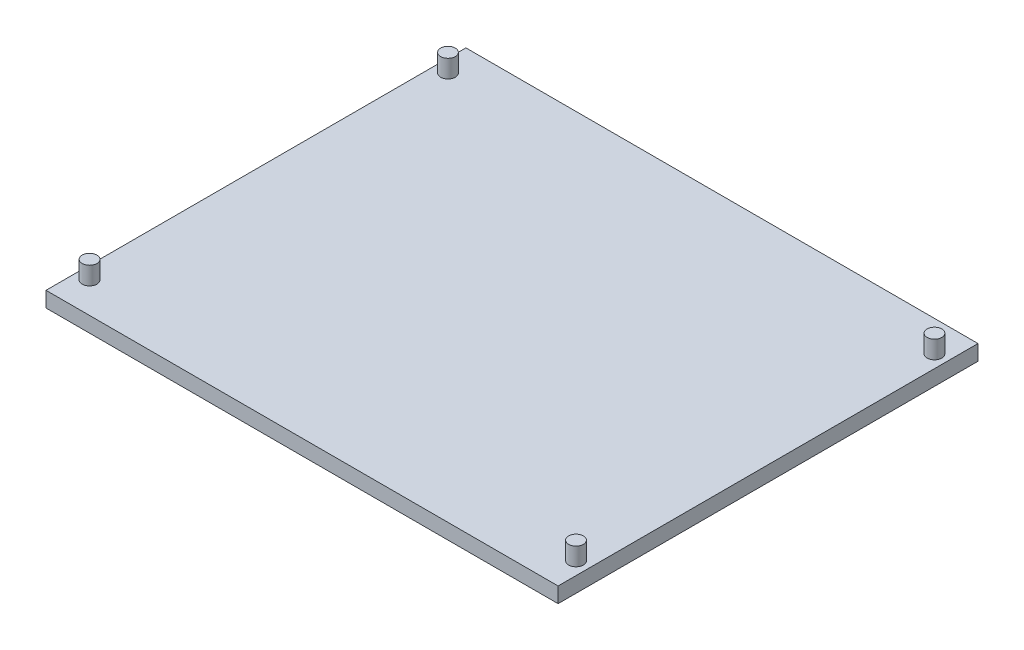
ISO-10303-21;
HEADER;
FILE_DESCRIPTION(('STEP AP214'),'2;1');
FILE_NAME('part.step','',(''),(''),'','','');
FILE_SCHEMA(('AUTOMOTIVE_DESIGN { 1 0 10303 214 1 1 1 1 }'));
ENDSEC;
DATA;
#1=APPLICATION_CONTEXT('core data for automotive mechanical design processes');
#2=APPLICATION_PROTOCOL_DEFINITION('international standard','automotive_design',2000,#1);
#3=PRODUCT_CONTEXT('',#1,'mechanical');
#4=PRODUCT('Part','Part','',(#3));
#5=PRODUCT_RELATED_PRODUCT_CATEGORY('part','',(#4));
#6=PRODUCT_DEFINITION_FORMATION('','',#4);
#7=PRODUCT_DEFINITION_CONTEXT('part definition',#1,'design');
#8=PRODUCT_DEFINITION('design','',#6,#7);
#9=PRODUCT_DEFINITION_SHAPE('','',#8);
#10=(LENGTH_UNIT() NAMED_UNIT(*) SI_UNIT(.MILLI.,.METRE.));
#11=(NAMED_UNIT(*) PLANE_ANGLE_UNIT() SI_UNIT($,.RADIAN.));
#12=(NAMED_UNIT(*) SI_UNIT($,.STERADIAN.) SOLID_ANGLE_UNIT());
#13=UNCERTAINTY_MEASURE_WITH_UNIT(LENGTH_MEASURE(1.E-05),#10,'distance_accuracy_value','');
#14=(GEOMETRIC_REPRESENTATION_CONTEXT(3) GLOBAL_UNCERTAINTY_ASSIGNED_CONTEXT((#13)) GLOBAL_UNIT_ASSIGNED_CONTEXT((#10,
#11,#12)) REPRESENTATION_CONTEXT('',''));
#15=CARTESIAN_POINT('',(0.,0.,0.));
#16=DIRECTION('',(0.,0.,1.));
#17=DIRECTION('',(1.,0.,0.));
#18=AXIS2_PLACEMENT_3D('',#15,#16,#17);
#19=CARTESIAN_POINT('',(50.,3.,41.));
#20=DIRECTION('',(-1.,0.,0.));
#21=DIRECTION('',(0.,0.,1.));
#22=AXIS2_PLACEMENT_3D('',#19,#20,#21);
#23=PLANE('',#22);
#24=DIRECTION('',(0.,0.,-1.));
#25=VECTOR('',#24,1.);
#26=CARTESIAN_POINT('',(50.,0.,41.));
#27=LINE('',#26,#25);
#28=CARTESIAN_POINT('',(50.,0.,41.));
#29=VERTEX_POINT('',#28);
#30=CARTESIAN_POINT('',(50.,0.,-41.));
#31=VERTEX_POINT('',#30);
#32=EDGE_CURVE('E108',#29,#31,#27,.T.);
#33=ORIENTED_EDGE('',*,*,#32,.T.);
#34=DIRECTION('',(0.,-1.,0.));
#35=VECTOR('',#34,1.);
#36=CARTESIAN_POINT('',(50.,3.,-41.));
#37=LINE('',#36,#35);
#38=CARTESIAN_POINT('',(50.,3.,-41.));
#39=VERTEX_POINT('',#38);
#40=EDGE_CURVE('E99',#39,#31,#37,.T.);
#41=ORIENTED_EDGE('',*,*,#40,.F.);
#42=DIRECTION('',(0.,0.,-1.));
#43=VECTOR('',#42,1.);
#44=CARTESIAN_POINT('',(50.,3.,41.));
#45=LINE('',#44,#43);
#46=CARTESIAN_POINT('',(50.,3.,41.));
#47=VERTEX_POINT('',#46);
#48=EDGE_CURVE('E93',#47,#39,#45,.T.);
#49=ORIENTED_EDGE('',*,*,#48,.F.);
#50=DIRECTION('',(0.,-1.,0.));
#51=VECTOR('',#50,1.);
#52=CARTESIAN_POINT('',(50.,3.,41.));
#53=LINE('',#52,#51);
#54=EDGE_CURVE('E104',#47,#29,#53,.T.);
#55=ORIENTED_EDGE('',*,*,#54,.T.);
#56=EDGE_LOOP('',(#33,#41,#49,#55));
#57=FACE_BOUND('',#56,.T.);
#58=ADVANCED_FACE('F41',(#57),#23,.F.);
#59=CARTESIAN_POINT('',(-50.,3.,-41.));
#60=DIRECTION('',(0.,0.,1.));
#61=DIRECTION('',(1.,0.,0.));
#62=AXIS2_PLACEMENT_3D('',#59,#60,#61);
#63=PLANE('',#62);
#64=DIRECTION('',(-1.,0.,0.));
#65=VECTOR('',#64,1.);
#66=CARTESIAN_POINT('',(-50.,0.,-41.));
#67=LINE('',#66,#65);
#68=CARTESIAN_POINT('',(-50.,0.,-41.));
#69=VERTEX_POINT('',#68);
#70=EDGE_CURVE('E98',#31,#69,#67,.T.);
#71=ORIENTED_EDGE('',*,*,#70,.T.);
#72=DIRECTION('',(0.,-1.,0.));
#73=VECTOR('',#72,1.);
#74=CARTESIAN_POINT('',(-50.,3.,-41.));
#75=LINE('',#74,#73);
#76=CARTESIAN_POINT('',(-50.,3.,-41.));
#77=VERTEX_POINT('',#76);
#78=EDGE_CURVE('E96',#77,#69,#75,.T.);
#79=ORIENTED_EDGE('',*,*,#78,.F.);
#80=DIRECTION('',(-1.,0.,0.));
#81=VECTOR('',#80,1.);
#82=CARTESIAN_POINT('',(-50.,3.,-41.));
#83=LINE('',#82,#81);
#84=EDGE_CURVE('E88',#39,#77,#83,.T.);
#85=ORIENTED_EDGE('',*,*,#84,.F.);
#86=ORIENTED_EDGE('',*,*,#40,.T.);
#87=EDGE_LOOP('',(#71,#79,#85,#86));
#88=FACE_BOUND('',#87,.T.);
#89=ADVANCED_FACE('F97',(#88),#63,.F.);
#90=CARTESIAN_POINT('',(-50.,3.,41.));
#91=DIRECTION('',(1.,0.,0.));
#92=DIRECTION('',(0.,0.,-1.));
#93=AXIS2_PLACEMENT_3D('',#90,#91,#92);
#94=PLANE('',#93);
#95=DIRECTION('',(0.,0.,1.));
#96=VECTOR('',#95,1.);
#97=CARTESIAN_POINT('',(-50.,0.,41.));
#98=LINE('',#97,#96);
#99=CARTESIAN_POINT('',(-50.,0.,41.));
#100=VERTEX_POINT('',#99);
#101=EDGE_CURVE('E74',#69,#100,#98,.T.);
#102=ORIENTED_EDGE('',*,*,#101,.T.);
#103=DIRECTION('',(0.,-1.,0.));
#104=VECTOR('',#103,1.);
#105=CARTESIAN_POINT('',(-50.,3.,41.));
#106=LINE('',#105,#104);
#107=CARTESIAN_POINT('',(-50.,3.,41.));
#108=VERTEX_POINT('',#107);
#109=EDGE_CURVE('E100',#108,#100,#106,.T.);
#110=ORIENTED_EDGE('',*,*,#109,.F.);
#111=DIRECTION('',(0.,0.,1.));
#112=VECTOR('',#111,1.);
#113=CARTESIAN_POINT('',(-50.,3.,41.));
#114=LINE('',#113,#112);
#115=EDGE_CURVE('E91',#77,#108,#114,.T.);
#116=ORIENTED_EDGE('',*,*,#115,.F.);
#117=ORIENTED_EDGE('',*,*,#78,.T.);
#118=EDGE_LOOP('',(#102,#110,#116,#117));
#119=FACE_BOUND('',#118,.T.);
#120=ADVANCED_FACE('F102',(#119),#94,.F.);
#121=CARTESIAN_POINT('',(-50.,3.,41.));
#122=DIRECTION('',(0.,0.,-1.));
#123=DIRECTION('',(-1.,0.,0.));
#124=AXIS2_PLACEMENT_3D('',#121,#122,#123);
#125=PLANE('',#124);
#126=DIRECTION('',(1.,0.,0.));
#127=VECTOR('',#126,1.);
#128=CARTESIAN_POINT('',(-50.,0.,41.));
#129=LINE('',#128,#127);
#130=EDGE_CURVE('E80',#100,#29,#129,.T.);
#131=ORIENTED_EDGE('',*,*,#130,.T.);
#132=ORIENTED_EDGE('',*,*,#54,.F.);
#133=DIRECTION('',(1.,0.,0.));
#134=VECTOR('',#133,1.);
#135=CARTESIAN_POINT('',(-50.,3.,41.));
#136=LINE('',#135,#134);
#137=EDGE_CURVE('E57',#108,#47,#136,.T.);
#138=ORIENTED_EDGE('',*,*,#137,.F.);
#139=ORIENTED_EDGE('',*,*,#109,.T.);
#140=EDGE_LOOP('',(#131,#132,#138,#139));
#141=FACE_BOUND('',#140,.T.);
#142=ADVANCED_FACE('F131',(#141),#125,.F.);
#143=CARTESIAN_POINT('',(0.,3.,0.));
#144=DIRECTION('',(0.,-1.,0.));
#145=DIRECTION('',(0.,0.,-1.));
#146=AXIS2_PLACEMENT_3D('',#143,#144,#145);
#147=PLANE('',#146);
#148=CARTESIAN_POINT('',(-47.5,3.,35.));
#149=DIRECTION('',(0.,-1.,0.));
#150=DIRECTION('',(0.,0.,-1.));
#151=AXIS2_PLACEMENT_3D('',#148,#149,#150);
#152=CIRCLE('',#151,1.435);
#153=CARTESIAN_POINT('',(-47.5,3.,33.565));
#154=VERTEX_POINT('',#153);
#155=EDGE_CURVE('E11',#154,#154,#152,.F.);
#156=ORIENTED_EDGE('',*,*,#155,.F.);
#157=EDGE_LOOP('',(#156));
#158=FACE_BOUND('',#157,.T.);
#159=CARTESIAN_POINT('',(47.5,3.,35.));
#160=DIRECTION('',(0.,-1.,0.));
#161=DIRECTION('',(0.,0.,-1.));
#162=AXIS2_PLACEMENT_3D('',#159,#160,#161);
#163=CIRCLE('',#162,1.435);
#164=CARTESIAN_POINT('',(47.5,3.,33.565));
#165=VERTEX_POINT('',#164);
#166=EDGE_CURVE('E49',#165,#165,#163,.F.);
#167=ORIENTED_EDGE('',*,*,#166,.F.);
#168=EDGE_LOOP('',(#167));
#169=FACE_BOUND('',#168,.T.);
#170=CARTESIAN_POINT('',(47.5,3.,-35.));
#171=DIRECTION('',(0.,-1.,0.));
#172=DIRECTION('',(0.,0.,-1.));
#173=AXIS2_PLACEMENT_3D('',#170,#171,#172);
#174=CIRCLE('',#173,1.435);
#175=CARTESIAN_POINT('',(47.5,3.,-36.435));
#176=VERTEX_POINT('',#175);
#177=EDGE_CURVE('E121',#176,#176,#174,.F.);
#178=ORIENTED_EDGE('',*,*,#177,.F.);
#179=EDGE_LOOP('',(#178));
#180=FACE_BOUND('',#179,.T.);
#181=CARTESIAN_POINT('',(-47.5,3.,-35.));
#182=DIRECTION('',(0.,-1.,0.));
#183=DIRECTION('',(0.,0.,-1.));
#184=AXIS2_PLACEMENT_3D('',#181,#182,#183);
#185=CIRCLE('',#184,1.435);
#186=CARTESIAN_POINT('',(-47.5,3.,-36.435));
#187=VERTEX_POINT('',#186);
#188=EDGE_CURVE('E118',#187,#187,#185,.F.);
#189=ORIENTED_EDGE('',*,*,#188,.F.);
#190=EDGE_LOOP('',(#189));
#191=FACE_BOUND('',#190,.T.);
#192=ORIENTED_EDGE('',*,*,#48,.T.);
#193=ORIENTED_EDGE('',*,*,#84,.T.);
#194=ORIENTED_EDGE('',*,*,#115,.T.);
#195=ORIENTED_EDGE('',*,*,#137,.T.);
#196=EDGE_LOOP('',(#192,#193,#194,#195));
#197=FACE_BOUND('',#196,.T.);
#198=ADVANCED_FACE('F89',(#158,#169,#180,#191,#197),#147,.F.);
#199=CARTESIAN_POINT('',(0.,0.,0.));
#200=DIRECTION('',(0.,-1.,0.));
#201=DIRECTION('',(0.,0.,-1.));
#202=AXIS2_PLACEMENT_3D('',#199,#200,#201);
#203=PLANE('',#202);
#204=ORIENTED_EDGE('',*,*,#32,.F.);
#205=ORIENTED_EDGE('',*,*,#130,.F.);
#206=ORIENTED_EDGE('',*,*,#101,.F.);
#207=ORIENTED_EDGE('',*,*,#70,.F.);
#208=EDGE_LOOP('',(#204,#205,#206,#207));
#209=FACE_BOUND('',#208,.T.);
#210=ADVANCED_FACE('F130',(#209),#203,.T.);
#211=CARTESIAN_POINT('',(-47.5,6.5,-35.));
#212=DIRECTION('',(0.,-1.,0.));
#213=DIRECTION('',(0.,0.,-1.));
#214=AXIS2_PLACEMENT_3D('',#211,#212,#213);
#215=CYLINDRICAL_SURFACE('',#214,1.435);
#216=CARTESIAN_POINT('',(-47.5,6.5,-35.));
#217=DIRECTION('',(0.,1.,0.));
#218=DIRECTION('',(0.,0.,1.));
#219=AXIS2_PLACEMENT_3D('',#216,#217,#218);
#220=CIRCLE('',#219,1.435);
#221=CARTESIAN_POINT('',(-47.5,6.5,-33.565));
#222=VERTEX_POINT('',#221);
#223=EDGE_CURVE('E111',#222,#222,#220,.T.);
#224=ORIENTED_EDGE('',*,*,#223,.F.);
#225=EDGE_LOOP('',(#224));
#226=FACE_BOUND('',#225,.T.);
#227=ORIENTED_EDGE('',*,*,#188,.T.);
#228=EDGE_LOOP('',(#227));
#229=FACE_BOUND('',#228,.T.);
#230=ADVANCED_FACE('F138',(#226,#229),#215,.T.);
#231=CARTESIAN_POINT('',(-47.5,6.5,-35.));
#232=DIRECTION('',(0.,1.,0.));
#233=DIRECTION('',(0.,0.,1.));
#234=AXIS2_PLACEMENT_3D('',#231,#232,#233);
#235=PLANE('',#234);
#236=ORIENTED_EDGE('',*,*,#223,.T.);
#237=EDGE_LOOP('',(#236));
#238=FACE_BOUND('',#237,.T.);
#239=ADVANCED_FACE('F140',(#238),#235,.T.);
#240=CARTESIAN_POINT('',(47.5,6.5,-35.));
#241=DIRECTION('',(0.,-1.,0.));
#242=DIRECTION('',(0.,0.,-1.));
#243=AXIS2_PLACEMENT_3D('',#240,#241,#242);
#244=CYLINDRICAL_SURFACE('',#243,1.435);
#245=CARTESIAN_POINT('',(47.5,6.5,-35.));
#246=DIRECTION('',(0.,1.,0.));
#247=DIRECTION('',(0.,0.,-1.));
#248=AXIS2_PLACEMENT_3D('',#245,#246,#247);
#249=CIRCLE('',#248,1.435);
#250=CARTESIAN_POINT('',(47.5,6.5,-36.435));
#251=VERTEX_POINT('',#250);
#252=EDGE_CURVE('E299',#251,#251,#249,.T.);
#253=ORIENTED_EDGE('',*,*,#252,.F.);
#254=EDGE_LOOP('',(#253));
#255=FACE_BOUND('',#254,.T.);
#256=ORIENTED_EDGE('',*,*,#177,.T.);
#257=EDGE_LOOP('',(#256));
#258=FACE_BOUND('',#257,.T.);
#259=ADVANCED_FACE('F147',(#255,#258),#244,.T.);
#260=CARTESIAN_POINT('',(47.5,6.5,-35.));
#261=DIRECTION('',(0.,-1.,0.));
#262=DIRECTION('',(0.,0.,-1.));
#263=AXIS2_PLACEMENT_3D('',#260,#261,#262);
#264=PLANE('',#263);
#265=ORIENTED_EDGE('',*,*,#252,.T.);
#266=EDGE_LOOP('',(#265));
#267=FACE_BOUND('',#266,.T.);
#268=ADVANCED_FACE('F220',(#267),#264,.F.);
#269=CARTESIAN_POINT('',(47.5,6.5,35.));
#270=DIRECTION('',(0.,-1.,0.));
#271=DIRECTION('',(0.,0.,-1.));
#272=AXIS2_PLACEMENT_3D('',#269,#270,#271);
#273=CYLINDRICAL_SURFACE('',#272,1.435);
#274=CARTESIAN_POINT('',(47.5,6.5,35.));
#275=DIRECTION('',(0.,1.,0.));
#276=DIRECTION('',(0.,0.,1.));
#277=AXIS2_PLACEMENT_3D('',#274,#275,#276);
#278=CIRCLE('',#277,1.435);
#279=CARTESIAN_POINT('',(47.5,6.5,36.435));
#280=VERTEX_POINT('',#279);
#281=EDGE_CURVE('E296',#280,#280,#278,.T.);
#282=ORIENTED_EDGE('',*,*,#281,.F.);
#283=EDGE_LOOP('',(#282));
#284=FACE_BOUND('',#283,.T.);
#285=ORIENTED_EDGE('',*,*,#166,.T.);
#286=EDGE_LOOP('',(#285));
#287=FACE_BOUND('',#286,.T.);
#288=ADVANCED_FACE('F126',(#284,#287),#273,.T.);
#289=CARTESIAN_POINT('',(47.5,6.5,35.));
#290=DIRECTION('',(0.,1.,0.));
#291=DIRECTION('',(0.,0.,1.));
#292=AXIS2_PLACEMENT_3D('',#289,#290,#291);
#293=PLANE('',#292);
#294=ORIENTED_EDGE('',*,*,#281,.T.);
#295=EDGE_LOOP('',(#294));
#296=FACE_BOUND('',#295,.T.);
#297=ADVANCED_FACE('F239',(#296),#293,.T.);
#298=CARTESIAN_POINT('',(-47.5,6.5,35.));
#299=DIRECTION('',(0.,-1.,0.));
#300=DIRECTION('',(0.,0.,-1.));
#301=AXIS2_PLACEMENT_3D('',#298,#299,#300);
#302=CYLINDRICAL_SURFACE('',#301,1.435);
#303=CARTESIAN_POINT('',(-47.5,6.5,35.));
#304=DIRECTION('',(0.,1.,0.));
#305=DIRECTION('',(0.,0.,-1.));
#306=AXIS2_PLACEMENT_3D('',#303,#304,#305);
#307=CIRCLE('',#306,1.435);
#308=CARTESIAN_POINT('',(-47.5,6.5,33.565));
#309=VERTEX_POINT('',#308);
#310=EDGE_CURVE('E295',#309,#309,#307,.T.);
#311=ORIENTED_EDGE('',*,*,#310,.F.);
#312=EDGE_LOOP('',(#311));
#313=FACE_BOUND('',#312,.T.);
#314=ORIENTED_EDGE('',*,*,#155,.T.);
#315=EDGE_LOOP('',(#314));
#316=FACE_BOUND('',#315,.T.);
#317=ADVANCED_FACE('F249',(#313,#316),#302,.T.);
#318=CARTESIAN_POINT('',(-47.5,6.5,35.));
#319=DIRECTION('',(0.,-1.,0.));
#320=DIRECTION('',(0.,0.,-1.));
#321=AXIS2_PLACEMENT_3D('',#318,#319,#320);
#322=PLANE('',#321);
#323=ORIENTED_EDGE('',*,*,#310,.T.);
#324=EDGE_LOOP('',(#323));
#325=FACE_BOUND('',#324,.T.);
#326=ADVANCED_FACE('F259',(#325),#322,.F.);
#327=CLOSED_SHELL('',(#58,#89,#120,#142,#198,#210,#230,#239,#259,#268,#288,#297,#317,#326));
#328=MANIFOLD_SOLID_BREP('B2',#327);
#329=ADVANCED_BREP_SHAPE_REPRESENTATION('',(#18,#328),#14);
#330=SHAPE_DEFINITION_REPRESENTATION(#9,#329);
ENDSEC;
END-ISO-10303-21;
